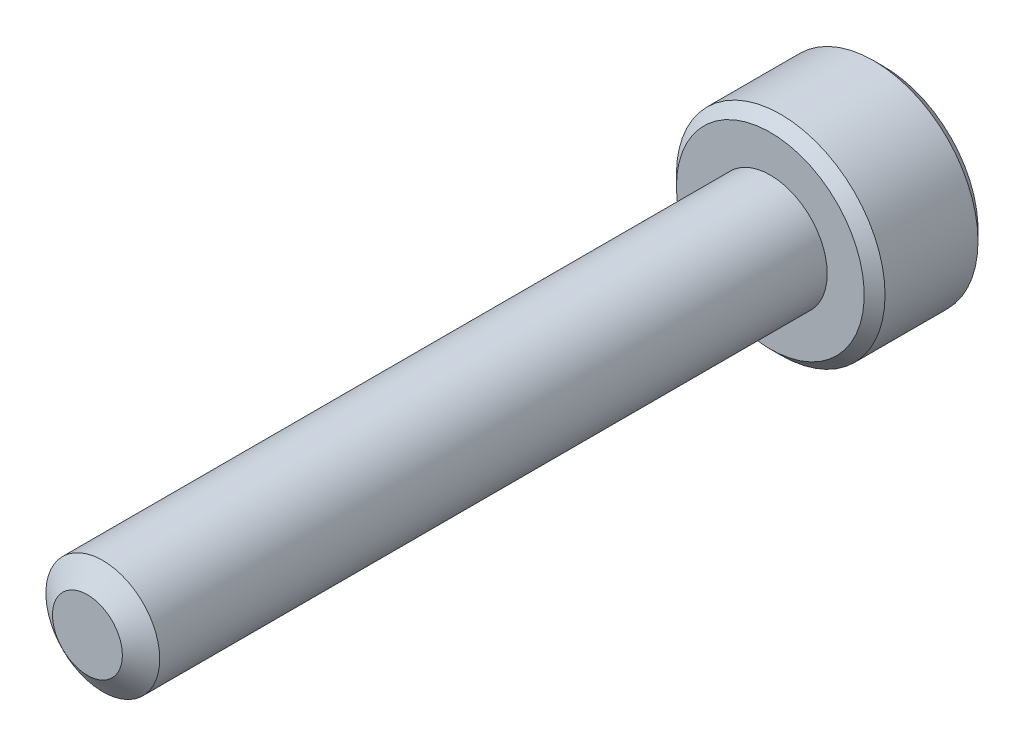
ISO-10303-21;
HEADER;
FILE_DESCRIPTION(('STEP AP214'),'2;1');
FILE_NAME('part.step','',(''),(''),'','','');
FILE_SCHEMA(('AUTOMOTIVE_DESIGN { 1 0 10303 214 1 1 1 1 }'));
ENDSEC;
DATA;
#1=APPLICATION_CONTEXT('core data for automotive mechanical design processes');
#2=APPLICATION_PROTOCOL_DEFINITION('international standard','automotive_design',2000,#1);
#3=PRODUCT_CONTEXT('',#1,'mechanical');
#4=PRODUCT('Part','Part','',(#3));
#5=PRODUCT_RELATED_PRODUCT_CATEGORY('part','',(#4));
#6=PRODUCT_DEFINITION_FORMATION('','',#4);
#7=PRODUCT_DEFINITION_CONTEXT('part definition',#1,'design');
#8=PRODUCT_DEFINITION('design','',#6,#7);
#9=PRODUCT_DEFINITION_SHAPE('','',#8);
#10=(LENGTH_UNIT() NAMED_UNIT(*) SI_UNIT(.MILLI.,.METRE.));
#11=(NAMED_UNIT(*) PLANE_ANGLE_UNIT() SI_UNIT($,.RADIAN.));
#12=(NAMED_UNIT(*) SI_UNIT($,.STERADIAN.) SOLID_ANGLE_UNIT());
#13=UNCERTAINTY_MEASURE_WITH_UNIT(LENGTH_MEASURE(1.E-05),#10,'distance_accuracy_value','');
#14=(GEOMETRIC_REPRESENTATION_CONTEXT(3) GLOBAL_UNCERTAINTY_ASSIGNED_CONTEXT((#13)) GLOBAL_UNIT_ASSIGNED_CONTEXT((#10,
#11,#12)) REPRESENTATION_CONTEXT('',''));
#15=CARTESIAN_POINT('',(0.,0.,0.));
#16=DIRECTION('',(0.,0.,1.));
#17=DIRECTION('',(1.,0.,0.));
#18=AXIS2_PLACEMENT_3D('',#15,#16,#17);
#19=CARTESIAN_POINT('',(0.,0.,-18.));
#20=DIRECTION('',(0.,0.,1.));
#21=DIRECTION('',(1.,0.,0.));
#22=AXIS2_PLACEMENT_3D('',#19,#20,#21);
#23=CYLINDRICAL_SURFACE('',#22,1.5);
#24=CARTESIAN_POINT('',(0.,0.,-18.));
#25=DIRECTION('',(0.,0.,-1.));
#26=DIRECTION('',(-1.,0.,0.));
#27=AXIS2_PLACEMENT_3D('',#24,#25,#26);
#28=CIRCLE('',#27,1.5);
#29=CARTESIAN_POINT('',(-1.5,0.,-18.));
#30=VERTEX_POINT('',#29);
#31=EDGE_CURVE('E214',#30,#30,#28,.F.);
#32=ORIENTED_EDGE('',*,*,#31,.T.);
#33=EDGE_LOOP('',(#32));
#34=FACE_BOUND('',#33,.T.);
#35=CARTESIAN_POINT('',(0.,0.,-0.40525178320938));
#36=DIRECTION('',(0.,0.,1.));
#37=DIRECTION('',(1.,0.,0.));
#38=AXIS2_PLACEMENT_3D('',#35,#36,#37);
#39=CIRCLE('',#38,1.5);
#40=CARTESIAN_POINT('',(1.5,0.,-0.40525178320938));
#41=VERTEX_POINT('',#40);
#42=EDGE_CURVE('E108',#41,#41,#39,.T.);
#43=ORIENTED_EDGE('',*,*,#42,.F.);
#44=EDGE_LOOP('',(#43));
#45=FACE_BOUND('',#44,.T.);
#46=ADVANCED_FACE('F34',(#34,#45),#23,.T.);
#47=CARTESIAN_POINT('',(0.,0.,0.));
#48=DIRECTION('',(0.,0.,-1.));
#49=DIRECTION('',(-1.,0.,0.));
#50=AXIS2_PLACEMENT_3D('',#47,#48,#49);
#51=CONICAL_SURFACE('',#50,0.921240473580834,0.959931088596884);
#52=ORIENTED_EDGE('',*,*,#42,.T.);
#53=EDGE_LOOP('',(#52));
#54=FACE_BOUND('',#53,.T.);
#55=CARTESIAN_POINT('',(0.,0.,0.));
#56=DIRECTION('',(0.,0.,1.));
#57=DIRECTION('',(1.,0.,0.));
#58=AXIS2_PLACEMENT_3D('',#55,#56,#57);
#59=CIRCLE('',#58,0.921240473580834);
#60=CARTESIAN_POINT('',(0.921240473580834,0.,0.));
#61=VERTEX_POINT('',#60);
#62=EDGE_CURVE('E212',#61,#61,#59,.T.);
#63=ORIENTED_EDGE('',*,*,#62,.F.);
#64=EDGE_LOOP('',(#63));
#65=FACE_BOUND('',#64,.T.);
#66=ADVANCED_FACE('F195',(#54,#65),#51,.T.);
#67=CARTESIAN_POINT('',(0.,0.,0.));
#68=DIRECTION('',(0.,0.,1.));
#69=DIRECTION('',(1.,0.,0.));
#70=AXIS2_PLACEMENT_3D('',#67,#68,#69);
#71=PLANE('',#70);
#72=ORIENTED_EDGE('',*,*,#62,.T.);
#73=EDGE_LOOP('',(#72));
#74=FACE_BOUND('',#73,.T.);
#75=ADVANCED_FACE('F192',(#74),#71,.T.);
#76=CARTESIAN_POINT('',(0.,0.,-21.));
#77=DIRECTION('',(0.,0.,1.));
#78=DIRECTION('',(1.,0.,0.));
#79=AXIS2_PLACEMENT_3D('',#76,#77,#78);
#80=CYLINDRICAL_SURFACE('',#79,2.75);
#81=CARTESIAN_POINT('',(0.,0.,-20.725));
#82=DIRECTION('',(0.,0.,-1.));
#83=DIRECTION('',(-1.,0.,0.));
#84=AXIS2_PLACEMENT_3D('',#81,#82,#83);
#85=CIRCLE('',#84,2.75);
#86=CARTESIAN_POINT('',(-2.75,0.,-20.725));
#87=VERTEX_POINT('',#86);
#88=EDGE_CURVE('E42',#87,#87,#85,.F.);
#89=ORIENTED_EDGE('',*,*,#88,.T.);
#90=EDGE_LOOP('',(#89));
#91=FACE_BOUND('',#90,.T.);
#92=CARTESIAN_POINT('',(0.,0.,-18.275));
#93=DIRECTION('',(0.,0.,-1.));
#94=DIRECTION('',(-1.,0.,0.));
#95=AXIS2_PLACEMENT_3D('',#92,#93,#94);
#96=CIRCLE('',#95,2.75);
#97=CARTESIAN_POINT('',(-2.75,0.,-18.275));
#98=VERTEX_POINT('',#97);
#99=EDGE_CURVE('E171',#98,#98,#96,.T.);
#100=ORIENTED_EDGE('',*,*,#99,.T.);
#101=EDGE_LOOP('',(#100));
#102=FACE_BOUND('',#101,.T.);
#103=ADVANCED_FACE('F176',(#91,#102),#80,.T.);
#104=CARTESIAN_POINT('',(0.,0.,-21.));
#105=DIRECTION('',(0.,0.,-1.));
#106=DIRECTION('',(-1.,0.,0.));
#107=AXIS2_PLACEMENT_3D('',#104,#105,#106);
#108=PLANE('',#107);
#109=CARTESIAN_POINT('',(0.,0.,-21.));
#110=DIRECTION('',(0.,0.,-1.));
#111=DIRECTION('',(-1.,0.,0.));
#112=AXIS2_PLACEMENT_3D('',#109,#110,#111);
#113=CIRCLE('',#112,2.47499999999999);
#114=CARTESIAN_POINT('',(-2.47499999999999,0.,-21.));
#115=VERTEX_POINT('',#114);
#116=EDGE_CURVE('E107',#115,#115,#113,.T.);
#117=ORIENTED_EDGE('',*,*,#116,.T.);
#118=EDGE_LOOP('',(#117));
#119=FACE_BOUND('',#118,.T.);
#120=CARTESIAN_POINT('',(0.,0.,-21.));
#121=DIRECTION('',(0.,0.,-1.));
#122=DIRECTION('',(-1.,0.,0.));
#123=AXIS2_PLACEMENT_3D('',#120,#121,#122);
#124=CIRCLE('',#123,1.44337567297406);
#125=CARTESIAN_POINT('',(-1.25,0.721687836487031,-21.));
#126=VERTEX_POINT('',#125);
#127=CARTESIAN_POINT('',(0.,1.44337567297406,-21.));
#128=VERTEX_POINT('',#127);
#129=EDGE_CURVE('E88',#126,#128,#124,.T.);
#130=ORIENTED_EDGE('',*,*,#129,.F.);
#131=CARTESIAN_POINT('',(-1.25,-0.721687836487032,-21.));
#132=VERTEX_POINT('',#131);
#133=EDGE_CURVE('E48',#132,#126,#124,.T.);
#134=ORIENTED_EDGE('',*,*,#133,.F.);
#135=CARTESIAN_POINT('',(0.,-1.44337567297406,-21.));
#136=VERTEX_POINT('',#135);
#137=EDGE_CURVE('E273',#136,#132,#124,.T.);
#138=ORIENTED_EDGE('',*,*,#137,.F.);
#139=CARTESIAN_POINT('',(1.25,-0.721687836487032,-21.));
#140=VERTEX_POINT('',#139);
#141=EDGE_CURVE('E55',#140,#136,#124,.T.);
#142=ORIENTED_EDGE('',*,*,#141,.F.);
#143=CARTESIAN_POINT('',(1.25,0.721687836487033,-21.));
#144=VERTEX_POINT('',#143);
#145=EDGE_CURVE('E129',#144,#140,#124,.T.);
#146=ORIENTED_EDGE('',*,*,#145,.F.);
#147=EDGE_CURVE('E97',#128,#144,#124,.T.);
#148=ORIENTED_EDGE('',*,*,#147,.F.);
#149=EDGE_LOOP('',(#130,#134,#138,#142,#146,#148));
#150=FACE_BOUND('',#149,.T.);
#151=ADVANCED_FACE('F128',(#119,#150),#108,.T.);
#152=CARTESIAN_POINT('',(0.,0.,-18.));
#153=DIRECTION('',(0.,0.,-1.));
#154=DIRECTION('',(-1.,0.,0.));
#155=AXIS2_PLACEMENT_3D('',#152,#153,#154);
#156=PLANE('',#155);
#157=CARTESIAN_POINT('',(0.,0.,-18.));
#158=DIRECTION('',(0.,0.,-1.));
#159=DIRECTION('',(-1.,0.,0.));
#160=AXIS2_PLACEMENT_3D('',#157,#158,#159);
#161=CIRCLE('',#160,2.475);
#162=CARTESIAN_POINT('',(-2.475,0.,-18.));
#163=VERTEX_POINT('',#162);
#164=EDGE_CURVE('E11',#163,#163,#161,.F.);
#165=ORIENTED_EDGE('',*,*,#164,.T.);
#166=EDGE_LOOP('',(#165));
#167=FACE_BOUND('',#166,.T.);
#168=ORIENTED_EDGE('',*,*,#31,.F.);
#169=EDGE_LOOP('',(#168));
#170=FACE_BOUND('',#169,.T.);
#171=ADVANCED_FACE('F185',(#167,#170),#156,.F.);
#172=CARTESIAN_POINT('',(0.,0.,-21.));
#173=DIRECTION('',(0.,0.,-1.));
#174=DIRECTION('',(-1.,0.,0.));
#175=AXIS2_PLACEMENT_3D('',#172,#173,#174);
#176=CONICAL_SURFACE('',#175,1.44337567297406,0.78539816339745);
#177=ORIENTED_EDGE('',*,*,#147,.T.);
#178=CARTESIAN_POINT('',(-0.000200000000000119,1.4434911430279,-21.0001154839091));
#179=CARTESIAN_POINT('',(0.0427751670715862,1.41867941875065,-20.9753216680551));
#180=CARTESIAN_POINT('',(0.0864690047459468,1.39345276980743,-20.9519837344187));
#181=CARTESIAN_POINT('',(0.17556593084194,1.34201263554194,-20.9092520040845));
#182=CARTESIAN_POINT('',(0.220977498357061,1.31579425481277,-20.8898819923604));
#183=CARTESIAN_POINT('',(0.312547820935256,1.26292610442246,-20.8567004834135));
#184=CARTESIAN_POINT('',(0.358683240175882,1.23628980770471,-20.8428055590527));
#185=CARTESIAN_POINT('',(0.451970080407588,1.18243062538509,-20.8213972821606));
#186=CARTESIAN_POINT('',(0.499118649136375,1.15520938653762,-20.8138679415668));
#187=CARTESIAN_POINT('',(0.580373556887248,1.10829684367467,-20.8070744980507));
#188=CARTESIAN_POINT('',(0.614374876627936,1.08866617256958,-20.8060685591044));
#189=CARTESIAN_POINT('',(0.682317764432473,1.04943932800611,-20.8077614149113));
#190=CARTESIAN_POINT('',(0.716259317655653,1.029843163116,-20.8104610272155));
#191=CARTESIAN_POINT('',(0.783814856457495,0.990839954603502,-20.8194089303164));
#192=CARTESIAN_POINT('',(0.81742850728677,0.971433104248774,-20.8256605258997));
#193=CARTESIAN_POINT('',(0.884094638217808,0.932943395609908,-20.8413756814139));
#194=CARTESIAN_POINT('',(0.917146871030291,0.913860680098303,-20.8508406200875));
#195=CARTESIAN_POINT('',(1.00179969160026,0.86498635135457,-20.8789313906876));
#196=CARTESIAN_POINT('',(1.05286649242963,0.835502920149078,-20.8996701574522));
#197=CARTESIAN_POINT('',(1.15300085411325,0.777690319475909,-20.9463871346715));
#198=CARTESIAN_POINT('',(1.20207431157827,0.749357745598417,-20.9723482959468));
#199=CARTESIAN_POINT('',(1.2502,0.721572366433194,-21.0001154839091));
#200=B_SPLINE_CURVE_WITH_KNOTS('',3,(#178,#179,#180,#181,#182,#183,#184,#185,#186,#187,#188,
#189,#190,#191,#192,#193,#194,#195,#196,#197,#198,#199),.UNSPECIFIED.,.F.,.F.,(4,2,2,2,2,2,2,2,
2,2,4),(0.,0.166533409618302,0.334037607289759,0.498880396489693,0.66330791924027,
0.780963963458822,0.898645970148448,1.01643764860773,1.13427993171549,1.32148652032141,
1.50809158792574),.UNSPECIFIED.);
#201=EDGE_CURVE('E102',#128,#144,#200,.T.);
#202=ORIENTED_EDGE('',*,*,#201,.F.);
#203=EDGE_LOOP('',(#177,#202));
#204=FACE_BOUND('',#203,.T.);
#205=ADVANCED_FACE('F103',(#204),#176,.F.);
#206=ORIENTED_EDGE('',*,*,#145,.T.);
#207=CARTESIAN_POINT('',(1.25,-1.43934010808077,-21.4629820968923));
#208=CARTESIAN_POINT('',(1.25,-1.40429313005659,-21.4365249226329));
#209=CARTESIAN_POINT('',(1.25,-1.36905087135599,-21.4103271603543));
#210=CARTESIAN_POINT('',(1.25,-1.29809650706311,-21.3585575718396));
#211=CARTESIAN_POINT('',(1.25,-1.26238428576495,-21.3329859043563));
#212=CARTESIAN_POINT('',(1.25,-1.15390111792708,-21.2570059936895));
#213=CARTESIAN_POINT('',(1.25,-1.08031646726265,-21.2077402861896));
#214=CARTESIAN_POINT('',(1.25,-0.926012322755096,-21.1110258302631));
#215=CARTESIAN_POINT('',(1.25,-0.845125318656147,-21.0638412989418));
#216=CARTESIAN_POINT('',(1.25,-0.679311174076602,-20.9775307343904));
#217=CARTESIAN_POINT('',(1.25,-0.594398891026689,-20.9383775346269));
#218=CARTESIAN_POINT('',(1.25,-0.466944812460741,-20.8904772236883));
#219=CARTESIAN_POINT('',(1.25,-0.426289985812821,-20.8767294897863));
#220=CARTESIAN_POINT('',(1.25,-0.343998850091267,-20.8524979274505));
#221=CARTESIAN_POINT('',(1.25,-0.302362473614962,-20.8420143238698));
#222=CARTESIAN_POINT('',(1.25,-0.219052696285666,-20.8250301617483));
#223=CARTESIAN_POINT('',(1.25,-0.1773934284745,-20.8184613604714));
#224=CARTESIAN_POINT('',(1.25,-0.0936293693401925,-20.8094350534578));
#225=CARTESIAN_POINT('',(1.25,-0.0515246558543963,-20.8069768409973));
#226=CARTESIAN_POINT('',(1.25,0.0311890576306316,-20.8063540620133));
#227=CARTESIAN_POINT('',(1.25,0.0717969625499306,-20.8080371168462));
#228=CARTESIAN_POINT('',(1.25,0.152668636885198,-20.8152682705979));
#229=CARTESIAN_POINT('',(1.25,0.192932338835359,-20.8208171104131));
#230=CARTESIAN_POINT('',(1.25,0.273499879165296,-20.8355710364649));
#231=CARTESIAN_POINT('',(1.25,0.313792180618512,-20.8448381759641));
#232=CARTESIAN_POINT('',(1.25,0.393496413911458,-20.8665361784573));
#233=CARTESIAN_POINT('',(1.25,0.432908419115059,-20.8789667767306));
#234=CARTESIAN_POINT('',(1.25,0.556992735862298,-20.9227793529314));
#235=CARTESIAN_POINT('',(1.25,0.639898924666085,-20.959151072876));
#236=CARTESIAN_POINT('',(1.25,0.801816555499701,-21.0400191621783));
#237=CARTESIAN_POINT('',(1.25,0.880812666325045,-21.084544720912));
#238=CARTESIAN_POINT('',(1.25,1.0317856127975,-21.1764048766666));
#239=CARTESIAN_POINT('',(1.25,1.10391618485086,-21.2234899339162));
#240=CARTESIAN_POINT('',(1.25,1.2101860604331,-21.2962785615985));
#241=CARTESIAN_POINT('',(1.25,1.24515069969379,-21.3207980853934));
#242=CARTESIAN_POINT('',(1.25,1.31460220852736,-21.3704856367657));
#243=CARTESIAN_POINT('',(1.25,1.34908920596618,-21.3956534854155));
#244=CARTESIAN_POINT('',(1.25,1.38337731682912,-21.4210901488412));
#245=B_SPLINE_CURVE_WITH_KNOTS('',3,(#207,#208,#209,#210,#211,#212,#213,#214,#215,#216,#217,
#218,#219,#220,#221,#222,#223,#224,#225,#226,#227,#228,#229,#230,#231,#232,#233,#234,#235,#236,
#237,#238,#239,#240,#241,#242,#243,#244),.UNSPECIFIED.,.F.,.F.,(4,2,2,2,2,2,2,2,2,2,2,2,2,2,2,2,
2,2,4),(0.,0.131732960381449,0.263498984161645,0.529042014455827,0.80974192613462,
1.08947609717225,1.21811634272577,1.34676544783901,1.47310084517844,1.59941451973785,
1.7211504216785,1.84290966131735,1.96679153905342,2.09066305366039,2.36146692896009,
2.63325989198491,2.89154668212279,3.01965734507713,3.14773302245628),.UNSPECIFIED.);
#246=EDGE_CURVE('E96',#144,#140,#245,.F.);
#247=ORIENTED_EDGE('',*,*,#246,.F.);
#248=EDGE_LOOP('',(#206,#247));
#249=FACE_BOUND('',#248,.T.);
#250=ADVANCED_FACE('F279',(#249),#176,.F.);
#251=ORIENTED_EDGE('',*,*,#141,.T.);
#252=CARTESIAN_POINT('',(1.2502,-0.721572366433195,-21.0001154839091));
#253=CARTESIAN_POINT('',(1.20722483292841,-0.746384090710444,-20.9753216680551));
#254=CARTESIAN_POINT('',(1.16353099525405,-0.771610739653665,-20.9519837344187));
#255=CARTESIAN_POINT('',(1.07443406915806,-0.823050873919155,-20.9092520040845));
#256=CARTESIAN_POINT('',(1.02902250164294,-0.849269254648334,-20.8898819923604));
#257=CARTESIAN_POINT('',(0.937452179064739,-0.902137405038636,-20.8567004834135));
#258=CARTESIAN_POINT('',(0.891316759824113,-0.928773701756388,-20.8428055590527));
#259=CARTESIAN_POINT('',(0.798029919592407,-0.982632884076014,-20.8213972821606));
#260=CARTESIAN_POINT('',(0.750881350863619,-1.00985412292348,-20.8138679415668));
#261=CARTESIAN_POINT('',(0.669626443112747,-1.05676666578643,-20.8070744980507));
#262=CARTESIAN_POINT('',(0.635625123372058,-1.07639733689152,-20.8060685591044));
#263=CARTESIAN_POINT('',(0.567682235567521,-1.11562418145499,-20.8077614149113));
#264=CARTESIAN_POINT('',(0.533740682344341,-1.1352203463451,-20.8104610272155));
#265=CARTESIAN_POINT('',(0.466185143542499,-1.1742235548576,-20.8194089303164));
#266=CARTESIAN_POINT('',(0.432571492713223,-1.19363040521233,-20.8256605258997));
#267=CARTESIAN_POINT('',(0.365905361782185,-1.23212011385119,-20.8413756814139));
#268=CARTESIAN_POINT('',(0.332853128969703,-1.2512028293628,-20.8508406200875));
#269=CARTESIAN_POINT('',(0.248200308399734,-1.30007715810653,-20.8789313906876));
#270=CARTESIAN_POINT('',(0.19713350757036,-1.32956058931202,-20.8996701574522));
#271=CARTESIAN_POINT('',(0.096999145886744,-1.38737318998519,-20.9463871346715));
#272=CARTESIAN_POINT('',(0.0479256884217298,-1.41570576386268,-20.9723482959468));
#273=CARTESIAN_POINT('',(-0.000199999999999849,-1.4434911430279,-21.0001154839091));
#274=B_SPLINE_CURVE_WITH_KNOTS('',3,(#252,#253,#254,#255,#256,#257,#258,#259,#260,#261,#262,
#263,#264,#265,#266,#267,#268,#269,#270,#271,#272,#273),.UNSPECIFIED.,.F.,.F.,(4,2,2,2,2,2,2,2,
2,2,4),(0.,0.166533409618304,0.334037607289763,0.4988803964897,0.663307919240276,
0.780963963458829,0.898645970148455,1.01643764860774,1.1342799317155,1.32148652032141,
1.50809158792574),.UNSPECIFIED.);
#275=EDGE_CURVE('E139',#140,#136,#274,.T.);
#276=ORIENTED_EDGE('',*,*,#275,.F.);
#277=EDGE_LOOP('',(#251,#276));
#278=FACE_BOUND('',#277,.T.);
#279=ADVANCED_FACE('F276',(#278),#176,.F.);
#280=ORIENTED_EDGE('',*,*,#137,.T.);
#281=CARTESIAN_POINT('',(0.000200000000000315,-1.4434911430279,-21.0001154839091));
#282=CARTESIAN_POINT('',(-0.0427751670715865,-1.41867941875065,-20.9753216680551));
#283=CARTESIAN_POINT('',(-0.0864690047459478,-1.39345276980743,-20.9519837344187));
#284=CARTESIAN_POINT('',(-0.175565930841942,-1.34201263554194,-20.9092520040845));
#285=CARTESIAN_POINT('',(-0.220977498357064,-1.31579425481276,-20.8898819923604));
#286=CARTESIAN_POINT('',(-0.312547820935261,-1.26292610442246,-20.8567004834135));
#287=CARTESIAN_POINT('',(-0.358683240175886,-1.23628980770471,-20.8428055590527));
#288=CARTESIAN_POINT('',(-0.451970080407593,-1.18243062538508,-20.8213972821606));
#289=CARTESIAN_POINT('',(-0.49911864913638,-1.15520938653761,-20.8138679415668));
#290=CARTESIAN_POINT('',(-0.580373556887253,-1.10829684367467,-20.8070744980507));
#291=CARTESIAN_POINT('',(-0.614374876627942,-1.08866617256958,-20.8060685591044));
#292=CARTESIAN_POINT('',(-0.682317764432478,-1.04943932800611,-20.8077614149113));
#293=CARTESIAN_POINT('',(-0.716259317655658,-1.02984316311599,-20.8104610272155));
#294=CARTESIAN_POINT('',(-0.783814856457501,-0.990839954603499,-20.8194089303164));
#295=CARTESIAN_POINT('',(-0.817428507286776,-0.971433104248771,-20.8256605258997));
#296=CARTESIAN_POINT('',(-0.884094638217814,-0.932943395609905,-20.8413756814139));
#297=CARTESIAN_POINT('',(-0.917146871030296,-0.9138606800983,-20.8508406200875));
#298=CARTESIAN_POINT('',(-1.00179969160027,-0.864986351354568,-20.8789313906876));
#299=CARTESIAN_POINT('',(-1.05286649242964,-0.835502920149076,-20.8996701574522));
#300=CARTESIAN_POINT('',(-1.15300085411326,-0.777690319475908,-20.9463871346715));
#301=CARTESIAN_POINT('',(-1.20207431157827,-0.749357745598416,-20.9723482959468));
#302=CARTESIAN_POINT('',(-1.2502,-0.721572366433194,-21.0001154839091));
#303=B_SPLINE_CURVE_WITH_KNOTS('',3,(#281,#282,#283,#284,#285,#286,#287,#288,#289,#290,#291,
#292,#293,#294,#295,#296,#297,#298,#299,#300,#301,#302),.UNSPECIFIED.,.F.,.F.,(4,2,2,2,2,2,2,2,
2,2,4),(0.,0.166533409618304,0.334037607289763,0.4988803964897,0.663307919240276,
0.780963963458828,0.898645970148455,1.01643764860773,1.1342799317155,1.32148652032141,
1.50809158792574),.UNSPECIFIED.);
#304=EDGE_CURVE('E250',#136,#132,#303,.T.);
#305=ORIENTED_EDGE('',*,*,#304,.F.);
#306=EDGE_LOOP('',(#280,#305));
#307=FACE_BOUND('',#306,.T.);
#308=ADVANCED_FACE('F275',(#307),#176,.F.);
#309=ORIENTED_EDGE('',*,*,#133,.T.);
#310=CARTESIAN_POINT('',(-1.25,-1.43934010829019,-21.4629820970504));
#311=CARTESIAN_POINT('',(-1.25,-1.40429313026013,-21.4365249227849));
#312=CARTESIAN_POINT('',(-1.25,-1.36905087155364,-21.4103271605002));
#313=CARTESIAN_POINT('',(-1.25,-1.29809650724891,-21.3585575719734));
#314=CARTESIAN_POINT('',(-1.25,-1.2623842859448,-21.3329859044841));
#315=CARTESIAN_POINT('',(-1.25,-1.1539011180887,-21.257005993799));
#316=CARTESIAN_POINT('',(-1.25,-1.08031646741187,-21.207740286287));
#317=CARTESIAN_POINT('',(-1.25,-0.926012322877302,-21.1110258303356));
#318=CARTESIAN_POINT('',(-1.25,-0.845125318763649,-21.0638412990016));
#319=CARTESIAN_POINT('',(-1.25,-0.679311174153444,-20.9775307344266));
#320=CARTESIAN_POINT('',(-1.25,-0.594398891087585,-20.9383775346522));
#321=CARTESIAN_POINT('',(-1.25,-0.46694481250964,-20.8904772237056));
#322=CARTESIAN_POINT('',(-1.25,-0.426289985866746,-20.8767294898039));
#323=CARTESIAN_POINT('',(-1.25,-0.343998850155404,-20.8524979274677));
#324=CARTESIAN_POINT('',(-1.25,-0.302362473684287,-20.8420143238863));
#325=CARTESIAN_POINT('',(-1.25,-0.219052696365196,-20.8250301617622));
#326=CARTESIAN_POINT('',(-1.25,-0.177393428559045,-20.8184613604834));
#327=CARTESIAN_POINT('',(-1.25,-0.093629369434599,-20.809435053465));
#328=CARTESIAN_POINT('',(-1.25,-0.0515246559536496,-20.8069768410015));
#329=CARTESIAN_POINT('',(-1.25,0.0311890575224381,-20.8063540620107));
#330=CARTESIAN_POINT('',(-1.25,0.0717969624376315,-20.8080371168399));
#331=CARTESIAN_POINT('',(-1.25,0.152668636765092,-20.8152682705835));
#332=CARTESIAN_POINT('',(-1.25,0.192932338711553,-20.8208171103943));
#333=CARTESIAN_POINT('',(-1.25,0.273499879034188,-20.835571036437));
#334=CARTESIAN_POINT('',(-1.25,0.313792180483814,-20.8448381759314));
#335=CARTESIAN_POINT('',(-1.25,0.393496413769925,-20.8665361784149));
#336=CARTESIAN_POINT('',(-1.25,0.432908418970282,-20.8789667766833));
#337=CARTESIAN_POINT('',(-1.25,0.556992735685996,-20.9227793528609));
#338=CARTESIAN_POINT('',(-1.25,0.639898924463081,-20.9591510727842));
#339=CARTESIAN_POINT('',(-1.25,0.801816555245345,-21.0400191620416));
#340=CARTESIAN_POINT('',(-1.25,0.88081266604605,-21.0845447207516));
#341=CARTESIAN_POINT('',(-1.25,1.03178561247421,-21.176404876461));
#342=CARTESIAN_POINT('',(-1.25,1.10391618450775,-21.2234899336892));
#343=CARTESIAN_POINT('',(-1.25,1.2101860600607,-21.2962785613395));
#344=CARTESIAN_POINT('',(-1.25,1.24515069931176,-21.3207980851238));
#345=CARTESIAN_POINT('',(-1.25,1.31460220812614,-21.3704856364749));
#346=CARTESIAN_POINT('',(-1.25,1.34908920555539,-21.3956534851142));
#347=CARTESIAN_POINT('',(-1.25,1.38337731640878,-21.4210901485293));
#348=B_SPLINE_CURVE_WITH_KNOTS('',3,(#310,#311,#312,#313,#314,#315,#316,#317,#318,#319,#320,
#321,#322,#323,#324,#325,#326,#327,#328,#329,#330,#331,#332,#333,#334,#335,#336,#337,#338,#339,
#340,#341,#342,#343,#344,#345,#346,#347),.UNSPECIFIED.,.F.,.F.,(4,2,2,2,2,2,2,2,2,2,2,2,2,2,2,2,
2,2,4),(0.,0.131732960406523,0.263498984211802,0.529042014557084,0.809741926293179,
1.08947609738757,1.21811634292656,1.34676544802529,1.47310084535082,1.59941451989631,
1.72115042182424,1.84290966145034,1.96679153917269,2.09066305376595,2.36146692896707,
2.63325989189266,2.89154668194564,3.01965734485811,3.14773302219539),.UNSPECIFIED.);
#349=EDGE_CURVE('E118',#132,#126,#348,.T.);
#350=ORIENTED_EDGE('',*,*,#349,.F.);
#351=EDGE_LOOP('',(#309,#350));
#352=FACE_BOUND('',#351,.T.);
#353=ADVANCED_FACE('F288',(#352),#176,.F.);
#354=ORIENTED_EDGE('',*,*,#129,.T.);
#355=CARTESIAN_POINT('',(-1.2502,0.721572366433194,-21.0001154839091));
#356=CARTESIAN_POINT('',(-1.20722483292841,0.746384090710444,-20.9753216680551));
#357=CARTESIAN_POINT('',(-1.16353099525405,0.771610739653664,-20.9519837344187));
#358=CARTESIAN_POINT('',(-1.07443406915806,0.823050873919153,-20.9092520040845));
#359=CARTESIAN_POINT('',(-1.02902250164294,0.849269254648332,-20.8898819923604));
#360=CARTESIAN_POINT('',(-0.937452179064743,0.902137405038634,-20.8567004834135));
#361=CARTESIAN_POINT('',(-0.891316759824118,0.928773701756385,-20.8428055590527));
#362=CARTESIAN_POINT('',(-0.798029919592411,0.982632884076011,-20.8213972821606));
#363=CARTESIAN_POINT('',(-0.750881350863623,1.00985412292348,-20.8138679415668));
#364=CARTESIAN_POINT('',(-0.669626443112751,1.05676666578643,-20.8070744980507));
#365=CARTESIAN_POINT('',(-0.635625123372062,1.07639733689152,-20.8060685591044));
#366=CARTESIAN_POINT('',(-0.567682235567526,1.11562418145498,-20.8077614149113));
#367=CARTESIAN_POINT('',(-0.533740682344346,1.1352203463451,-20.8104610272155));
#368=CARTESIAN_POINT('',(-0.466185143542503,1.1742235548576,-20.8194089303164));
#369=CARTESIAN_POINT('',(-0.432571492713228,1.19363040521232,-20.8256605258997));
#370=CARTESIAN_POINT('',(-0.36590536178219,1.23212011385119,-20.8413756814139));
#371=CARTESIAN_POINT('',(-0.332853128969707,1.25120282936279,-20.8508406200875));
#372=CARTESIAN_POINT('',(-0.248200308399738,1.30007715810653,-20.8789313906876));
#373=CARTESIAN_POINT('',(-0.197133507570364,1.32956058931202,-20.8996701574522));
#374=CARTESIAN_POINT('',(-0.096999145886746,1.38737318998519,-20.9463871346715));
#375=CARTESIAN_POINT('',(-0.0479256884217307,1.41570576386268,-20.9723482959468));
#376=CARTESIAN_POINT('',(0.000200000000001136,1.4434911430279,-21.0001154839091));
#377=B_SPLINE_CURVE_WITH_KNOTS('',3,(#355,#356,#357,#358,#359,#360,#361,#362,#363,#364,#365,
#366,#367,#368,#369,#370,#371,#372,#373,#374,#375,#376),.UNSPECIFIED.,.F.,.F.,(4,2,2,2,2,2,2,2,
2,2,4),(0.,0.166533409618302,0.33403760728976,0.498880396489694,0.663307919240272,
0.780963963458824,0.89864597014845,1.01643764860773,1.13427993171549,1.32148652032141,
1.50809158792574),.UNSPECIFIED.);
#378=EDGE_CURVE('E92',#126,#128,#377,.T.);
#379=ORIENTED_EDGE('',*,*,#378,.F.);
#380=EDGE_LOOP('',(#354,#379));
#381=FACE_BOUND('',#380,.T.);
#382=ADVANCED_FACE('F90',(#381),#176,.F.);
#383=CARTESIAN_POINT('',(1.25,2.1650635094611,-19.125));
#384=DIRECTION('',(0.,0.,-1.));
#385=DIRECTION('',(-1.,0.,0.));
#386=AXIS2_PLACEMENT_3D('',#383,#384,#385);
#387=PLANE('',#386);
#388=DIRECTION('',(0.866025403784439,0.5,0.));
#389=VECTOR('',#388,1.);
#390=CARTESIAN_POINT('',(-1.25,0.721687836487032,-19.125));
#391=LINE('',#390,#389);
#392=CARTESIAN_POINT('',(-1.25,0.721687836487032,-19.125));
#393=VERTEX_POINT('',#392);
#394=CARTESIAN_POINT('',(0.,1.44337567297406,-19.125));
#395=VERTEX_POINT('',#394);
#396=EDGE_CURVE('E117',#393,#395,#391,.T.);
#397=ORIENTED_EDGE('',*,*,#396,.T.);
#398=DIRECTION('',(0.866025403784439,-0.5,0.));
#399=VECTOR('',#398,1.);
#400=CARTESIAN_POINT('',(0.,1.44337567297406,-19.125));
#401=LINE('',#400,#399);
#402=CARTESIAN_POINT('',(1.25,0.721687836487032,-19.125));
#403=VERTEX_POINT('',#402);
#404=EDGE_CURVE('E122',#395,#403,#401,.T.);
#405=ORIENTED_EDGE('',*,*,#404,.T.);
#406=DIRECTION('',(0.,-1.,0.));
#407=VECTOR('',#406,1.);
#408=CARTESIAN_POINT('',(1.25,0.721687836487032,-19.125));
#409=LINE('',#408,#407);
#410=CARTESIAN_POINT('',(1.25,-0.721687836487033,-19.125));
#411=VERTEX_POINT('',#410);
#412=EDGE_CURVE('E236',#403,#411,#409,.T.);
#413=ORIENTED_EDGE('',*,*,#412,.T.);
#414=DIRECTION('',(-0.866025403784439,-0.5,0.));
#415=VECTOR('',#414,1.);
#416=CARTESIAN_POINT('',(1.25,-0.721687836487033,-19.125));
#417=LINE('',#416,#415);
#418=CARTESIAN_POINT('',(0.,-1.44337567297406,-19.125));
#419=VERTEX_POINT('',#418);
#420=EDGE_CURVE('E233',#411,#419,#417,.T.);
#421=ORIENTED_EDGE('',*,*,#420,.T.);
#422=DIRECTION('',(-0.866025403784439,0.5,0.));
#423=VECTOR('',#422,1.);
#424=CARTESIAN_POINT('',(0.,-1.44337567297406,-19.125));
#425=LINE('',#424,#423);
#426=CARTESIAN_POINT('',(-1.25,-0.721687836487032,-19.125));
#427=VERTEX_POINT('',#426);
#428=EDGE_CURVE('E230',#419,#427,#425,.T.);
#429=ORIENTED_EDGE('',*,*,#428,.T.);
#430=DIRECTION('',(0.,1.,0.));
#431=VECTOR('',#430,1.);
#432=CARTESIAN_POINT('',(-1.25,-0.721687836487032,-19.125));
#433=LINE('',#432,#431);
#434=EDGE_CURVE('E125',#427,#393,#433,.T.);
#435=ORIENTED_EDGE('',*,*,#434,.T.);
#436=EDGE_LOOP('',(#397,#405,#413,#421,#429,#435));
#437=FACE_BOUND('',#436,.T.);
#438=ADVANCED_FACE('F159',(#437),#387,.T.);
#439=CARTESIAN_POINT('',(0.,1.44337567297406,-19.125));
#440=DIRECTION('',(0.5,0.866025403784439,0.));
#441=DIRECTION('',(-0.866025403784439,0.5,0.));
#442=AXIS2_PLACEMENT_3D('',#439,#440,#441);
#443=PLANE('',#442);
#444=DIRECTION('',(0.,0.,-1.));
#445=VECTOR('',#444,1.);
#446=CARTESIAN_POINT('',(0.,1.44337567297406,-19.125));
#447=LINE('',#446,#445);
#448=EDGE_CURVE('E114',#395,#128,#447,.T.);
#449=ORIENTED_EDGE('',*,*,#448,.T.);
#450=ORIENTED_EDGE('',*,*,#201,.T.);
#451=DIRECTION('',(0.,0.,-1.));
#452=VECTOR('',#451,1.);
#453=CARTESIAN_POINT('',(1.25,0.721687836487032,-19.125));
#454=LINE('',#453,#452);
#455=EDGE_CURVE('E124',#403,#144,#454,.T.);
#456=ORIENTED_EDGE('',*,*,#455,.F.);
#457=ORIENTED_EDGE('',*,*,#404,.F.);
#458=EDGE_LOOP('',(#449,#450,#456,#457));
#459=FACE_BOUND('',#458,.T.);
#460=ADVANCED_FACE('F120',(#459),#443,.F.);
#461=CARTESIAN_POINT('',(1.25,0.721687836487032,-19.125));
#462=DIRECTION('',(1.,0.,0.));
#463=DIRECTION('',(0.,0.,-1.));
#464=AXIS2_PLACEMENT_3D('',#461,#462,#463);
#465=PLANE('',#464);
#466=ORIENTED_EDGE('',*,*,#455,.T.);
#467=ORIENTED_EDGE('',*,*,#246,.T.);
#468=DIRECTION('',(0.,0.,-1.));
#469=VECTOR('',#468,1.);
#470=CARTESIAN_POINT('',(1.25,-0.721687836487033,-19.125));
#471=LINE('',#470,#469);
#472=EDGE_CURVE('E219',#411,#140,#471,.T.);
#473=ORIENTED_EDGE('',*,*,#472,.F.);
#474=ORIENTED_EDGE('',*,*,#412,.F.);
#475=EDGE_LOOP('',(#466,#467,#473,#474));
#476=FACE_BOUND('',#475,.T.);
#477=ADVANCED_FACE('F148',(#476),#465,.F.);
#478=CARTESIAN_POINT('',(1.25,-0.721687836487033,-19.125));
#479=DIRECTION('',(0.5,-0.866025403784439,0.));
#480=DIRECTION('',(0.866025403784439,0.5,0.));
#481=AXIS2_PLACEMENT_3D('',#478,#479,#480);
#482=PLANE('',#481);
#483=ORIENTED_EDGE('',*,*,#472,.T.);
#484=ORIENTED_EDGE('',*,*,#275,.T.);
#485=DIRECTION('',(0.,0.,-1.));
#486=VECTOR('',#485,1.);
#487=CARTESIAN_POINT('',(0.,-1.44337567297406,-19.125));
#488=LINE('',#487,#486);
#489=EDGE_CURVE('E222',#419,#136,#488,.T.);
#490=ORIENTED_EDGE('',*,*,#489,.F.);
#491=ORIENTED_EDGE('',*,*,#420,.F.);
#492=EDGE_LOOP('',(#483,#484,#490,#491));
#493=FACE_BOUND('',#492,.T.);
#494=ADVANCED_FACE('F152',(#493),#482,.F.);
#495=CARTESIAN_POINT('',(0.,-1.44337567297406,-19.125));
#496=DIRECTION('',(-0.5,-0.866025403784439,0.));
#497=DIRECTION('',(0.866025403784439,-0.5,0.));
#498=AXIS2_PLACEMENT_3D('',#495,#496,#497);
#499=PLANE('',#498);
#500=ORIENTED_EDGE('',*,*,#489,.T.);
#501=ORIENTED_EDGE('',*,*,#304,.T.);
#502=DIRECTION('',(0.,0.,-1.));
#503=VECTOR('',#502,1.);
#504=CARTESIAN_POINT('',(-1.25,-0.721687836487032,-19.125));
#505=LINE('',#504,#503);
#506=EDGE_CURVE('E225',#427,#132,#505,.T.);
#507=ORIENTED_EDGE('',*,*,#506,.F.);
#508=ORIENTED_EDGE('',*,*,#428,.F.);
#509=EDGE_LOOP('',(#500,#501,#507,#508));
#510=FACE_BOUND('',#509,.T.);
#511=ADVANCED_FACE('F258',(#510),#499,.F.);
#512=CARTESIAN_POINT('',(-1.25,-0.721687836487032,-19.125));
#513=DIRECTION('',(-1.,0.,0.));
#514=DIRECTION('',(0.,-1.,0.));
#515=AXIS2_PLACEMENT_3D('',#512,#513,#514);
#516=PLANE('',#515);
#517=ORIENTED_EDGE('',*,*,#506,.T.);
#518=ORIENTED_EDGE('',*,*,#349,.T.);
#519=DIRECTION('',(0.,0.,-1.));
#520=VECTOR('',#519,1.);
#521=CARTESIAN_POINT('',(-1.25,0.721687836487032,-19.125));
#522=LINE('',#521,#520);
#523=EDGE_CURVE('E116',#393,#126,#522,.T.);
#524=ORIENTED_EDGE('',*,*,#523,.F.);
#525=ORIENTED_EDGE('',*,*,#434,.F.);
#526=EDGE_LOOP('',(#517,#518,#524,#525));
#527=FACE_BOUND('',#526,.T.);
#528=ADVANCED_FACE('F255',(#527),#516,.F.);
#529=CARTESIAN_POINT('',(-1.25,0.721687836487032,-19.125));
#530=DIRECTION('',(-0.5,0.866025403784439,0.));
#531=DIRECTION('',(-0.866025403784439,-0.5,0.));
#532=AXIS2_PLACEMENT_3D('',#529,#530,#531);
#533=PLANE('',#532);
#534=ORIENTED_EDGE('',*,*,#523,.T.);
#535=ORIENTED_EDGE('',*,*,#378,.T.);
#536=ORIENTED_EDGE('',*,*,#448,.F.);
#537=ORIENTED_EDGE('',*,*,#396,.F.);
#538=EDGE_LOOP('',(#534,#535,#536,#537));
#539=FACE_BOUND('',#538,.T.);
#540=ADVANCED_FACE('F112',(#539),#533,.F.);
#541=CARTESIAN_POINT('',(0.,0.,-21.));
#542=DIRECTION('',(0.,0.,1.));
#543=DIRECTION('',(1.,0.,0.));
#544=AXIS2_PLACEMENT_3D('',#541,#542,#543);
#545=CONICAL_SURFACE('',#544,2.47499999999999,0.78539816339745);
#546=ORIENTED_EDGE('',*,*,#88,.F.);
#547=EDGE_LOOP('',(#546));
#548=FACE_BOUND('',#547,.T.);
#549=ORIENTED_EDGE('',*,*,#116,.F.);
#550=EDGE_LOOP('',(#549));
#551=FACE_BOUND('',#550,.T.);
#552=ADVANCED_FACE('F179',(#548,#551),#545,.T.);
#553=CARTESIAN_POINT('',(0.,0.,-18.275));
#554=DIRECTION('',(0.,0.,-1.));
#555=DIRECTION('',(-1.,0.,0.));
#556=AXIS2_PLACEMENT_3D('',#553,#554,#555);
#557=CONICAL_SURFACE('',#556,2.75,0.785398163397447);
#558=CARTESIAN_POINT('',(-2.475,0.,-18.));
#559=CARTESIAN_POINT('',(-2.47786458333333,0.,-18.0028645833333));
#560=CARTESIAN_POINT('',(-2.48072916666667,0.,-18.0057291666667));
#561=CARTESIAN_POINT('',(-2.48645833333333,0.,-18.0114583333333));
#562=CARTESIAN_POINT('',(-2.48932291666666,0.,-18.0143229166667));
#563=CARTESIAN_POINT('',(-2.49505208333333,0.,-18.0200520833333));
#564=CARTESIAN_POINT('',(-2.49791666666666,0.,-18.0229166666667));
#565=CARTESIAN_POINT('',(-2.50364583333333,0.,-18.0286458333333));
#566=CARTESIAN_POINT('',(-2.50651041666666,0.,-18.0315104166667));
#567=CARTESIAN_POINT('',(-2.51223958333333,0.,-18.0372395833333));
#568=CARTESIAN_POINT('',(-2.51510416666666,0.,-18.0401041666667));
#569=CARTESIAN_POINT('',(-2.52083333333333,0.,-18.0458333333333));
#570=CARTESIAN_POINT('',(-2.52369791666667,0.,-18.0486979166667));
#571=CARTESIAN_POINT('',(-2.52942708333333,0.,-18.0544270833333));
#572=CARTESIAN_POINT('',(-2.53229166666666,0.,-18.0572916666667));
#573=CARTESIAN_POINT('',(-2.53802083333333,0.,-18.0630208333333));
#574=CARTESIAN_POINT('',(-2.54088541666667,0.,-18.0658854166667));
#575=CARTESIAN_POINT('',(-2.54661458333333,0.,-18.0716145833333));
#576=CARTESIAN_POINT('',(-2.54947916666666,0.,-18.0744791666667));
#577=CARTESIAN_POINT('',(-2.55520833333333,0.,-18.0802083333333));
#578=CARTESIAN_POINT('',(-2.55807291666666,0.,-18.0830729166667));
#579=CARTESIAN_POINT('',(-2.56380208333333,0.,-18.0888020833333));
#580=CARTESIAN_POINT('',(-2.56666666666666,0.,-18.0916666666667));
#581=CARTESIAN_POINT('',(-2.57239583333333,0.,-18.0973958333333));
#582=CARTESIAN_POINT('',(-2.57526041666666,0.,-18.1002604166667));
#583=CARTESIAN_POINT('',(-2.58098958333333,0.,-18.1059895833333));
#584=CARTESIAN_POINT('',(-2.58385416666666,0.,-18.1088541666667));
#585=CARTESIAN_POINT('',(-2.58958333333333,0.,-18.1145833333333));
#586=CARTESIAN_POINT('',(-2.59244791666667,0.,-18.1174479166667));
#587=CARTESIAN_POINT('',(-2.59817708333333,0.,-18.1231770833333));
#588=CARTESIAN_POINT('',(-2.60104166666666,0.,-18.1260416666667));
#589=CARTESIAN_POINT('',(-2.60677083333333,0.,-18.1317708333333));
#590=CARTESIAN_POINT('',(-2.60963541666666,0.,-18.1346354166667));
#591=CARTESIAN_POINT('',(-2.61536458333333,0.,-18.1403645833333));
#592=CARTESIAN_POINT('',(-2.61822916666666,0.,-18.1432291666667));
#593=CARTESIAN_POINT('',(-2.62395833333333,0.,-18.1489583333333));
#594=CARTESIAN_POINT('',(-2.62682291666666,0.,-18.1518229166667));
#595=CARTESIAN_POINT('',(-2.63255208333333,0.,-18.1575520833333));
#596=CARTESIAN_POINT('',(-2.63541666666667,0.,-18.1604166666667));
#597=CARTESIAN_POINT('',(-2.64114583333333,0.,-18.1661458333333));
#598=CARTESIAN_POINT('',(-2.64401041666667,0.,-18.1690104166667));
#599=CARTESIAN_POINT('',(-2.64973958333333,0.,-18.1747395833333));
#600=CARTESIAN_POINT('',(-2.65260416666666,0.,-18.1776041666667));
#601=CARTESIAN_POINT('',(-2.65833333333333,0.,-18.1833333333333));
#602=CARTESIAN_POINT('',(-2.66119791666666,0.,-18.1861979166667));
#603=CARTESIAN_POINT('',(-2.66692708333333,0.,-18.1919270833333));
#604=CARTESIAN_POINT('',(-2.66979166666667,0.,-18.1947916666667));
#605=CARTESIAN_POINT('',(-2.67552083333333,0.,-18.2005208333333));
#606=CARTESIAN_POINT('',(-2.67838541666666,0.,-18.2033854166667));
#607=CARTESIAN_POINT('',(-2.68411458333333,0.,-18.2091145833333));
#608=CARTESIAN_POINT('',(-2.68697916666666,0.,-18.2119791666667));
#609=CARTESIAN_POINT('',(-2.69270833333333,0.,-18.2177083333333));
#610=CARTESIAN_POINT('',(-2.69557291666667,0.,-18.2205729166667));
#611=CARTESIAN_POINT('',(-2.70130208333333,0.,-18.2263020833333));
#612=CARTESIAN_POINT('',(-2.70416666666666,0.,-18.2291666666667));
#613=CARTESIAN_POINT('',(-2.70989583333333,0.,-18.2348958333333));
#614=CARTESIAN_POINT('',(-2.71276041666667,0.,-18.2377604166667));
#615=CARTESIAN_POINT('',(-2.71848958333333,0.,-18.2434895833333));
#616=CARTESIAN_POINT('',(-2.72135416666666,0.,-18.2463541666667));
#617=CARTESIAN_POINT('',(-2.72708333333333,0.,-18.2520833333333));
#618=CARTESIAN_POINT('',(-2.72994791666666,0.,-18.2549479166667));
#619=CARTESIAN_POINT('',(-2.73567708333333,0.,-18.2606770833333));
#620=CARTESIAN_POINT('',(-2.73854166666666,0.,-18.2635416666667));
#621=CARTESIAN_POINT('',(-2.74427083333333,0.,-18.2692708333333));
#622=CARTESIAN_POINT('',(-2.74713541666666,0.,-18.2721354166667));
#623=CARTESIAN_POINT('',(-2.75,0.,-18.275));
#624=B_SPLINE_CURVE_WITH_KNOTS('',3,(#558,#559,#560,#561,#562,#563,#564,#565,#566,#567,#568,
#569,#570,#571,#572,#573,#574,#575,#576,#577,#578,#579,#580,#581,#582,#583,#584,#585,#586,#587,
#588,#589,#590,#591,#592,#593,#594,#595,#596,#597,#598,#599,#600,#601,#602,#603,#604,#605,#606,
#607,#608,#609,#610,#611,#612,#613,#614,#615,#616,#617,#618,#619,#620,#621,#622,#623),
.UNSPECIFIED.,.F.,.F.,(4,2,2,2,2,2,2,2,2,2,2,2,2,2,2,2,2,2,2,2,2,2,2,2,2,2,2,2,2,2,2,2,4),(0.,
0.0121533978016418,0.0243067956032861,0.0364601934049304,0.048613591206575,0.0607669890082168,
0.0729203868098611,0.0850737846115054,0.09722718241315,0.109380580214794,0.121533978016436,
0.13368737581808,0.145840773619725,0.157994171421369,0.170147569223011,0.182300967024655,
0.1944543648263,0.206607762627944,0.218761160429588,0.23091455823123,0.243067956032875,
0.255221353834519,0.267374751636163,0.279528149437805,0.291681547239449,0.303834945041094,
0.315988342842738,0.328141740644382,0.340295138446024,0.352448536247669,0.364601934049313,
0.376755331850957,0.388908729652602),.UNSPECIFIED.);
#625=EDGE_CURVE('BSEAM36',#163,#98,#624,.T.);
#626=ORIENTED_EDGE('',*,*,#164,.F.);
#627=ORIENTED_EDGE('',*,*,#99,.F.);
#628=ORIENTED_EDGE('',*,*,#625,.T.);
#629=ORIENTED_EDGE('',*,*,#625,.F.);
#630=EDGE_LOOP('',(#626,#628,#627,#629));
#631=FACE_BOUND('',#630,.T.);
#632=ADVANCED_FACE('F36',(#631),#557,.T.);
#633=CLOSED_SHELL('',(#46,#66,#75,#103,#151,#171,#205,#250,#279,#308,#353,#382,#438,#460,#477,
#494,#511,#528,#540,#552,#632));
#634=MANIFOLD_SOLID_BREP('B2',#633);
#635=ADVANCED_BREP_SHAPE_REPRESENTATION('',(#18,#634),#14);
#636=SHAPE_DEFINITION_REPRESENTATION(#9,#635);
ENDSEC;
END-ISO-10303-21;
